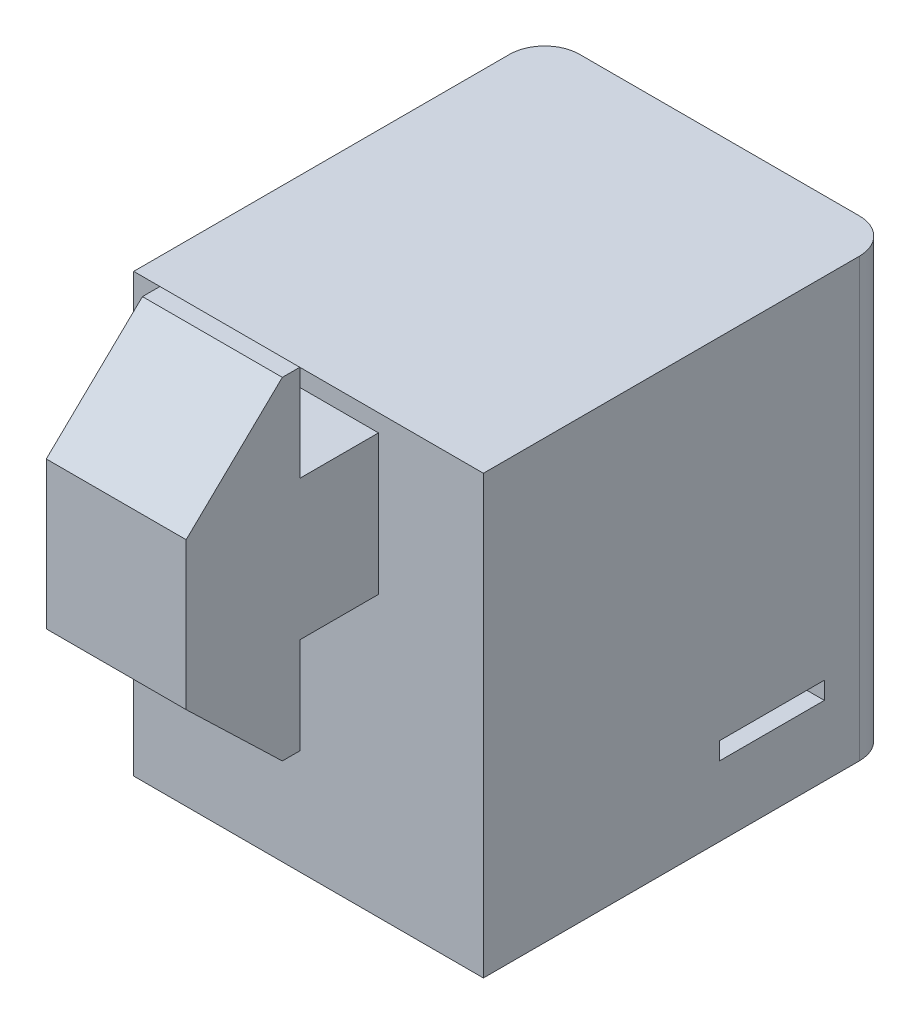
ISO-10303-21;
HEADER;
FILE_DESCRIPTION(('STEP AP214'),'2;1');
FILE_NAME('part.step','',(''),(''),'','','');
FILE_SCHEMA(('AUTOMOTIVE_DESIGN { 1 0 10303 214 1 1 1 1 }'));
ENDSEC;
DATA;
#1=APPLICATION_CONTEXT('core data for automotive mechanical design processes');
#2=APPLICATION_PROTOCOL_DEFINITION('international standard','automotive_design',2000,#1);
#3=PRODUCT_CONTEXT('',#1,'mechanical');
#4=PRODUCT('Part','Part','',(#3));
#5=PRODUCT_RELATED_PRODUCT_CATEGORY('part','',(#4));
#6=PRODUCT_DEFINITION_FORMATION('','',#4);
#7=PRODUCT_DEFINITION_CONTEXT('part definition',#1,'design');
#8=PRODUCT_DEFINITION('design','',#6,#7);
#9=PRODUCT_DEFINITION_SHAPE('','',#8);
#10=(LENGTH_UNIT() NAMED_UNIT(*) SI_UNIT(.MILLI.,.METRE.));
#11=(NAMED_UNIT(*) PLANE_ANGLE_UNIT() SI_UNIT($,.RADIAN.));
#12=(NAMED_UNIT(*) SI_UNIT($,.STERADIAN.) SOLID_ANGLE_UNIT());
#13=UNCERTAINTY_MEASURE_WITH_UNIT(LENGTH_MEASURE(1.E-05),#10,'distance_accuracy_value','');
#14=(GEOMETRIC_REPRESENTATION_CONTEXT(3) GLOBAL_UNCERTAINTY_ASSIGNED_CONTEXT((#13)) GLOBAL_UNIT_ASSIGNED_CONTEXT((#10,
#11,#12)) REPRESENTATION_CONTEXT('',''));
#15=CARTESIAN_POINT('',(0.,0.,0.));
#16=DIRECTION('',(0.,0.,1.));
#17=DIRECTION('',(1.,0.,0.));
#18=AXIS2_PLACEMENT_3D('',#15,#16,#17);
#19=CARTESIAN_POINT('',(4.,0.,0.));
#20=DIRECTION('',(1.,0.,0.));
#21=DIRECTION('',(0.,0.,-1.));
#22=AXIS2_PLACEMENT_3D('',#19,#20,#21);
#23=PLANE('',#22);
#24=DIRECTION('',(0.,-1.,0.));
#25=VECTOR('',#24,1.);
#26=CARTESIAN_POINT('',(4.,-20.,0.));
#27=LINE('',#26,#25);
#28=CARTESIAN_POINT('',(4.,3.99999999999983,0.));
#29=VERTEX_POINT('',#28);
#30=CARTESIAN_POINT('',(4.00000000000005,-3.99999999999983,0.));
#31=VERTEX_POINT('',#30);
#32=EDGE_CURVE('E420',#29,#31,#27,.T.);
#33=ORIENTED_EDGE('',*,*,#32,.F.);
#34=DIRECTION('',(0.,0.,1.));
#35=VECTOR('',#34,1.);
#36=CARTESIAN_POINT('',(4.00000000000005,3.99999999999983,0.));
#37=LINE('',#36,#35);
#38=CARTESIAN_POINT('',(4.00000000000005,3.99999999999983,4.5));
#39=VERTEX_POINT('',#38);
#40=EDGE_CURVE('E347',#29,#39,#37,.T.);
#41=ORIENTED_EDGE('',*,*,#40,.T.);
#42=DIRECTION('',(0.,1.,0.));
#43=VECTOR('',#42,1.);
#44=CARTESIAN_POINT('',(4.,5.,4.50000000000008));
#45=LINE('',#44,#43);
#46=CARTESIAN_POINT('',(4.,9.5,4.50000000000008));
#47=VERTEX_POINT('',#46);
#48=EDGE_CURVE('E381',#39,#47,#45,.T.);
#49=ORIENTED_EDGE('',*,*,#48,.T.);
#50=DIRECTION('',(0.,0.,-1.));
#51=VECTOR('',#50,1.);
#52=CARTESIAN_POINT('',(4.,9.5,4.50000000000008));
#53=LINE('',#52,#51);
#54=CARTESIAN_POINT('',(4.,9.5,5.50000000000008));
#55=VERTEX_POINT('',#54);
#56=EDGE_CURVE('E402',#55,#47,#53,.T.);
#57=ORIENTED_EDGE('',*,*,#56,.F.);
#58=DIRECTION('',(0.,0.693321869216339,-0.720628049458499));
#59=VECTOR('',#58,1.);
#60=CARTESIAN_POINT('',(4.,4.20840708524292,11.));
#61=LINE('',#60,#59);
#62=CARTESIAN_POINT('',(4.,4.20840708524292,11.));
#63=VERTEX_POINT('',#62);
#64=EDGE_CURVE('E393',#63,#55,#61,.T.);
#65=ORIENTED_EDGE('',*,*,#64,.F.);
#66=DIRECTION('',(0.,-1.,0.));
#67=VECTOR('',#66,1.);
#68=CARTESIAN_POINT('',(4.,5.,11.));
#69=LINE('',#68,#67);
#70=CARTESIAN_POINT('',(4.,-4.20840708524293,11.));
#71=VERTEX_POINT('',#70);
#72=EDGE_CURVE('E406',#63,#71,#69,.T.);
#73=ORIENTED_EDGE('',*,*,#72,.T.);
#74=DIRECTION('',(0.,-0.693321869216334,-0.720628049458505));
#75=VECTOR('',#74,1.);
#76=CARTESIAN_POINT('',(4.,-4.20840708524293,11.));
#77=LINE('',#76,#75);
#78=CARTESIAN_POINT('',(3.99999999999993,-9.5,5.5));
#79=VERTEX_POINT('',#78);
#80=EDGE_CURVE('E408',#71,#79,#77,.T.);
#81=ORIENTED_EDGE('',*,*,#80,.T.);
#82=DIRECTION('',(0.,0.,1.));
#83=VECTOR('',#82,1.);
#84=CARTESIAN_POINT('',(3.99999999999993,-9.5,4.5));
#85=LINE('',#84,#83);
#86=CARTESIAN_POINT('',(4.00000000000005,-9.5,4.5));
#87=VERTEX_POINT('',#86);
#88=EDGE_CURVE('E368',#87,#79,#85,.T.);
#89=ORIENTED_EDGE('',*,*,#88,.F.);
#90=DIRECTION('',(0.,1.,0.));
#91=VECTOR('',#90,1.);
#92=CARTESIAN_POINT('',(4.00000000000005,-20.,4.5));
#93=LINE('',#92,#91);
#94=CARTESIAN_POINT('',(4.00000000000005,-3.99999999999983,4.5));
#95=VERTEX_POINT('',#94);
#96=EDGE_CURVE('E350',#87,#95,#93,.T.);
#97=ORIENTED_EDGE('',*,*,#96,.T.);
#98=DIRECTION('',(0.,0.,1.));
#99=VECTOR('',#98,1.);
#100=CARTESIAN_POINT('',(4.00000000000005,-3.99999999999983,0.));
#101=LINE('',#100,#99);
#102=EDGE_CURVE('E362',#31,#95,#101,.T.);
#103=ORIENTED_EDGE('',*,*,#102,.F.);
#104=EDGE_LOOP('',(#33,#41,#49,#57,#65,#73,#81,#89,#97,#103));
#105=FACE_BOUND('',#104,.T.);
#106=ADVANCED_FACE('F33',(#105),#23,.T.);
#107=CARTESIAN_POINT('',(-10.,5.,11.));
#108=DIRECTION('',(1.,0.,0.));
#109=DIRECTION('',(0.,0.,-1.));
#110=AXIS2_PLACEMENT_3D('',#107,#108,#109);
#111=PLANE('',#110);
#112=DIRECTION('',(0.,1.,0.));
#113=VECTOR('',#112,1.);
#114=CARTESIAN_POINT('',(-10.,-16.,-13.5));
#115=LINE('',#114,#113);
#116=CARTESIAN_POINT('',(-10.,-16.,-13.5));
#117=VERTEX_POINT('',#116);
#118=CARTESIAN_POINT('',(-10.,-15.,-13.5));
#119=VERTEX_POINT('',#118);
#120=EDGE_CURVE('E310',#117,#119,#115,.T.);
#121=ORIENTED_EDGE('',*,*,#120,.F.);
#122=DIRECTION('',(0.,0.,1.));
#123=VECTOR('',#122,1.);
#124=CARTESIAN_POINT('',(-10.,-16.,-19.5));
#125=LINE('',#124,#123);
#126=CARTESIAN_POINT('',(-10.,-16.,-19.5));
#127=VERTEX_POINT('',#126);
#128=EDGE_CURVE('E288',#127,#117,#125,.T.);
#129=ORIENTED_EDGE('',*,*,#128,.F.);
#130=DIRECTION('',(0.,-1.,0.));
#131=VECTOR('',#130,1.);
#132=CARTESIAN_POINT('',(-10.,-15.,-19.5));
#133=LINE('',#132,#131);
#134=CARTESIAN_POINT('',(-10.,-15.,-19.5));
#135=VERTEX_POINT('',#134);
#136=EDGE_CURVE('E299',#135,#127,#133,.T.);
#137=ORIENTED_EDGE('',*,*,#136,.F.);
#138=DIRECTION('',(0.,0.,-1.));
#139=VECTOR('',#138,1.);
#140=CARTESIAN_POINT('',(-10.,-15.,-13.5));
#141=LINE('',#140,#139);
#142=EDGE_CURVE('E313',#119,#135,#141,.T.);
#143=ORIENTED_EDGE('',*,*,#142,.F.);
#144=EDGE_LOOP('',(#121,#129,#137,#143));
#145=FACE_BOUND('',#144,.T.);
#146=DIRECTION('',(0.,0.,1.));
#147=VECTOR('',#146,1.);
#148=CARTESIAN_POINT('',(-10.,5.,-23.5));
#149=LINE('',#148,#147);
#150=CARTESIAN_POINT('',(-10.,5.,-21.4999999999828));
#151=VERTEX_POINT('',#150);
#152=CARTESIAN_POINT('',(-9.99999999999996,5.,0.));
#153=VERTEX_POINT('',#152);
#154=EDGE_CURVE('E374',#151,#153,#149,.T.);
#155=ORIENTED_EDGE('',*,*,#154,.F.);
#156=DIRECTION('',(0.,1.,3.44815172583473E-12));
#157=VECTOR('',#156,1.);
#158=CARTESIAN_POINT('',(-10.,5.00000000011206,-21.4999999999828));
#159=LINE('',#158,#157);
#160=CARTESIAN_POINT('',(-10.,-20.,-21.500000000069));
#161=VERTEX_POINT('',#160);
#162=EDGE_CURVE('E11',#151,#161,#159,.F.);
#163=ORIENTED_EDGE('',*,*,#162,.T.);
#164=DIRECTION('',(0.,0.,-1.));
#165=VECTOR('',#164,1.);
#166=CARTESIAN_POINT('',(-10.,-20.,-23.5));
#167=LINE('',#166,#165);
#168=CARTESIAN_POINT('',(-9.99999999999996,-20.,0.));
#169=VERTEX_POINT('',#168);
#170=EDGE_CURVE('E384',#169,#161,#167,.T.);
#171=ORIENTED_EDGE('',*,*,#170,.F.);
#172=DIRECTION('',(0.,-1.,0.));
#173=VECTOR('',#172,1.);
#174=CARTESIAN_POINT('',(-9.99999999999996,5.,0.));
#175=LINE('',#174,#173);
#176=EDGE_CURVE('E338',#153,#169,#175,.T.);
#177=ORIENTED_EDGE('',*,*,#176,.F.);
#178=EDGE_LOOP('',(#155,#163,#171,#177));
#179=FACE_BOUND('',#178,.T.);
#180=ADVANCED_FACE('F480',(#145,#179),#111,.F.);
#181=CARTESIAN_POINT('',(4.,-20.,0.));
#182=DIRECTION('',(0.,-1.,0.));
#183=DIRECTION('',(0.,0.,-1.));
#184=AXIS2_PLACEMENT_3D('',#181,#182,#183);
#185=PLANE('',#184);
#186=CARTESIAN_POINT('',(7.49934200687802E-11,-20.,-11.9000248998002));
#187=DIRECTION('',(0.,-1.,0.));
#188=DIRECTION('',(0.,0.,-1.));
#189=AXIS2_PLACEMENT_3D('',#186,#187,#188);
#190=CIRCLE('',#189,3.100000000075);
#191=CARTESIAN_POINT('',(-3.10000000000001,-20.,-11.9000248998002));
#192=VERTEX_POINT('',#191);
#193=CARTESIAN_POINT('',(3.10000000014999,-20.,-11.9000248998002));
#194=VERTEX_POINT('',#193);
#195=EDGE_CURVE('E259',#192,#194,#190,.T.);
#196=ORIENTED_EDGE('',*,*,#195,.F.);
#197=DIRECTION('',(0.,0.,-1.));
#198=VECTOR('',#197,1.);
#199=CARTESIAN_POINT('',(-3.10000000000001,-20.,-8.09997510019977));
#200=LINE('',#199,#198);
#201=CARTESIAN_POINT('',(-3.10000000000001,-20.,-8.09997510019977));
#202=VERTEX_POINT('',#201);
#203=EDGE_CURVE('E267',#202,#192,#200,.T.);
#204=ORIENTED_EDGE('',*,*,#203,.F.);
#205=CARTESIAN_POINT('',(7.49929942054203E-11,-20.,-8.09997510019977));
#206=DIRECTION('',(0.,-1.,0.));
#207=DIRECTION('',(0.,0.,-1.));
#208=AXIS2_PLACEMENT_3D('',#205,#206,#207);
#209=CIRCLE('',#208,3.100000000075);
#210=CARTESIAN_POINT('',(3.10000000014999,-20.,-8.09997510019977));
#211=VERTEX_POINT('',#210);
#212=EDGE_CURVE('E281',#211,#202,#209,.T.);
#213=ORIENTED_EDGE('',*,*,#212,.F.);
#214=DIRECTION('',(0.,0.,1.));
#215=VECTOR('',#214,1.);
#216=CARTESIAN_POINT('',(3.10000000014999,-20.,-11.9000248998002));
#217=LINE('',#216,#215);
#218=EDGE_CURVE('E278',#194,#211,#217,.T.);
#219=ORIENTED_EDGE('',*,*,#218,.F.);
#220=EDGE_LOOP('',(#196,#204,#213,#219));
#221=FACE_BOUND('',#220,.T.);
#222=DIRECTION('',(1.,0.,0.));
#223=VECTOR('',#222,1.);
#224=CARTESIAN_POINT('',(4.,-20.,-23.5));
#225=LINE('',#224,#223);
#226=CARTESIAN_POINT('',(-8.,-20.,-23.5));
#227=VERTEX_POINT('',#226);
#228=CARTESIAN_POINT('',(8.,-20.,-23.5));
#229=VERTEX_POINT('',#228);
#230=EDGE_CURVE('E387',#227,#229,#225,.T.);
#231=ORIENTED_EDGE('',*,*,#230,.T.);
#232=CARTESIAN_POINT('',(8.,-20.,-21.500000000069));
#233=DIRECTION('',(0.,-1.,0.));
#234=DIRECTION('',(0.,0.,-1.));
#235=AXIS2_PLACEMENT_3D('',#232,#233,#234);
#236=CIRCLE('',#235,2.);
#237=CARTESIAN_POINT('',(10.,-20.,-21.500000000069));
#238=VERTEX_POINT('',#237);
#239=EDGE_CURVE('E41',#229,#238,#236,.T.);
#240=ORIENTED_EDGE('',*,*,#239,.T.);
#241=DIRECTION('',(0.,0.,-1.));
#242=VECTOR('',#241,1.);
#243=CARTESIAN_POINT('',(10.,-20.,-23.5));
#244=LINE('',#243,#242);
#245=CARTESIAN_POINT('',(10.,-20.,0.));
#246=VERTEX_POINT('',#245);
#247=EDGE_CURVE('E331',#246,#238,#244,.T.);
#248=ORIENTED_EDGE('',*,*,#247,.F.);
#249=DIRECTION('',(1.,0.,0.));
#250=VECTOR('',#249,1.);
#251=CARTESIAN_POINT('',(-9.99999999999996,-20.,0.));
#252=LINE('',#251,#250);
#253=EDGE_CURVE('E341',#169,#246,#252,.T.);
#254=ORIENTED_EDGE('',*,*,#253,.F.);
#255=ORIENTED_EDGE('',*,*,#170,.T.);
#256=CARTESIAN_POINT('',(-8.,-20.,-21.500000000069));
#257=DIRECTION('',(0.,-1.,0.));
#258=DIRECTION('',(0.,0.,-1.));
#259=AXIS2_PLACEMENT_3D('',#256,#257,#258);
#260=CIRCLE('',#259,2.);
#261=EDGE_CURVE('E459',#161,#227,#260,.T.);
#262=ORIENTED_EDGE('',*,*,#261,.T.);
#263=EDGE_LOOP('',(#231,#240,#248,#254,#255,#262));
#264=FACE_BOUND('',#263,.T.);
#265=ADVANCED_FACE('F463',(#221,#264),#185,.T.);
#266=CARTESIAN_POINT('',(4.,5.,-23.5));
#267=DIRECTION('',(0.,-1.,0.));
#268=DIRECTION('',(0.,0.,-1.));
#269=AXIS2_PLACEMENT_3D('',#266,#267,#268);
#270=PLANE('',#269);
#271=DIRECTION('',(0.,0.,1.));
#272=VECTOR('',#271,1.);
#273=CARTESIAN_POINT('',(10.,5.,0.));
#274=LINE('',#273,#272);
#275=CARTESIAN_POINT('',(10.,5.,-21.4999999999828));
#276=VERTEX_POINT('',#275);
#277=CARTESIAN_POINT('',(10.,5.,0.));
#278=VERTEX_POINT('',#277);
#279=EDGE_CURVE('E320',#276,#278,#274,.T.);
#280=ORIENTED_EDGE('',*,*,#279,.F.);
#281=CARTESIAN_POINT('',(8.,5.,-21.4999999999828));
#282=DIRECTION('',(0.,-1.,0.));
#283=DIRECTION('',(0.,0.,-1.));
#284=AXIS2_PLACEMENT_3D('',#281,#282,#283);
#285=CIRCLE('',#284,2.);
#286=CARTESIAN_POINT('',(8.,5.,-23.5));
#287=VERTEX_POINT('',#286);
#288=EDGE_CURVE('E453',#276,#287,#285,.F.);
#289=ORIENTED_EDGE('',*,*,#288,.T.);
#290=DIRECTION('',(-1.,0.,0.));
#291=VECTOR('',#290,1.);
#292=CARTESIAN_POINT('',(4.,5.,-23.5));
#293=LINE('',#292,#291);
#294=CARTESIAN_POINT('',(-8.,5.,-23.5));
#295=VERTEX_POINT('',#294);
#296=EDGE_CURVE('E371',#287,#295,#293,.T.);
#297=ORIENTED_EDGE('',*,*,#296,.T.);
#298=CARTESIAN_POINT('',(-8.,5.,-21.4999999999828));
#299=DIRECTION('',(0.,-1.,0.));
#300=DIRECTION('',(0.,0.,-1.));
#301=AXIS2_PLACEMENT_3D('',#298,#299,#300);
#302=CIRCLE('',#301,2.);
#303=EDGE_CURVE('E451',#295,#151,#302,.F.);
#304=ORIENTED_EDGE('',*,*,#303,.T.);
#305=ORIENTED_EDGE('',*,*,#154,.T.);
#306=DIRECTION('',(-1.,0.,0.));
#307=VECTOR('',#306,1.);
#308=CARTESIAN_POINT('',(4.00000000000005,5.,0.));
#309=LINE('',#308,#307);
#310=EDGE_CURVE('E335',#278,#153,#309,.T.);
#311=ORIENTED_EDGE('',*,*,#310,.F.);
#312=EDGE_LOOP('',(#280,#289,#297,#304,#305,#311));
#313=FACE_BOUND('',#312,.T.);
#314=ADVANCED_FACE('F473',(#313),#270,.F.);
#315=CARTESIAN_POINT('',(-4.,-4.20840708524293,11.));
#316=DIRECTION('',(0.,-0.720628049458505,0.693321869216334));
#317=DIRECTION('',(0.,-0.693321869216334,-0.720628049458505));
#318=AXIS2_PLACEMENT_3D('',#315,#316,#317);
#319=PLANE('',#318);
#320=ORIENTED_EDGE('',*,*,#80,.F.);
#321=DIRECTION('',(1.,0.,0.));
#322=VECTOR('',#321,1.);
#323=CARTESIAN_POINT('',(-4.,-4.20840708524293,11.));
#324=LINE('',#323,#322);
#325=CARTESIAN_POINT('',(-4.,-4.20840708524292,11.));
#326=VERTEX_POINT('',#325);
#327=EDGE_CURVE('E417',#326,#71,#324,.T.);
#328=ORIENTED_EDGE('',*,*,#327,.F.);
#329=DIRECTION('',(0.,-0.693321869216334,-0.720628049458505));
#330=VECTOR('',#329,1.);
#331=CARTESIAN_POINT('',(-4.,-4.20840708524293,11.));
#332=LINE('',#331,#330);
#333=CARTESIAN_POINT('',(-4.00000000000007,-9.5,5.5));
#334=VERTEX_POINT('',#333);
#335=EDGE_CURVE('E411',#326,#334,#332,.T.);
#336=ORIENTED_EDGE('',*,*,#335,.T.);
#337=DIRECTION('',(1.,0.,0.));
#338=VECTOR('',#337,1.);
#339=CARTESIAN_POINT('',(-4.,-9.5,5.5));
#340=LINE('',#339,#338);
#341=EDGE_CURVE('E414',#334,#79,#340,.T.);
#342=ORIENTED_EDGE('',*,*,#341,.T.);
#343=EDGE_LOOP('',(#320,#328,#336,#342));
#344=FACE_BOUND('',#343,.T.);
#345=ADVANCED_FACE('F524',(#344),#319,.T.);
#346=CARTESIAN_POINT('',(4.,5.,11.));
#347=DIRECTION('',(0.,0.,-1.));
#348=DIRECTION('',(0.,1.,0.));
#349=AXIS2_PLACEMENT_3D('',#346,#347,#348);
#350=PLANE('',#349);
#351=DIRECTION('',(1.,0.,0.));
#352=VECTOR('',#351,1.);
#353=CARTESIAN_POINT('',(-4.,4.20840708524292,11.));
#354=LINE('',#353,#352);
#355=CARTESIAN_POINT('',(-4.,4.20840708524292,11.));
#356=VERTEX_POINT('',#355);
#357=EDGE_CURVE('E397',#356,#63,#354,.T.);
#358=ORIENTED_EDGE('',*,*,#357,.F.);
#359=DIRECTION('',(0.,1.,0.));
#360=VECTOR('',#359,1.);
#361=CARTESIAN_POINT('',(-4.,-9.5,11.));
#362=LINE('',#361,#360);
#363=EDGE_CURVE('E389',#326,#356,#362,.T.);
#364=ORIENTED_EDGE('',*,*,#363,.F.);
#365=ORIENTED_EDGE('',*,*,#327,.T.);
#366=ORIENTED_EDGE('',*,*,#72,.F.);
#367=EDGE_LOOP('',(#358,#364,#365,#366));
#368=FACE_BOUND('',#367,.T.);
#369=ADVANCED_FACE('F520',(#368),#350,.F.);
#370=CARTESIAN_POINT('',(-10.,9.5,2.25000000000004));
#371=DIRECTION('',(0.,1.,0.));
#372=DIRECTION('',(0.,0.,1.));
#373=AXIS2_PLACEMENT_3D('',#370,#371,#372);
#374=PLANE('',#373);
#375=DIRECTION('',(1.,0.,0.));
#376=VECTOR('',#375,1.);
#377=CARTESIAN_POINT('',(-4.,9.5,4.5));
#378=LINE('',#377,#376);
#379=CARTESIAN_POINT('',(-4.,9.5,4.5));
#380=VERTEX_POINT('',#379);
#381=EDGE_CURVE('E375',#380,#47,#378,.T.);
#382=ORIENTED_EDGE('',*,*,#381,.F.);
#383=DIRECTION('',(0.,0.,-1.));
#384=VECTOR('',#383,1.);
#385=CARTESIAN_POINT('',(-4.,9.5,5.50000000000008));
#386=LINE('',#385,#384);
#387=CARTESIAN_POINT('',(-4.,9.5,5.50000000000008));
#388=VERTEX_POINT('',#387);
#389=EDGE_CURVE('E370',#388,#380,#386,.T.);
#390=ORIENTED_EDGE('',*,*,#389,.F.);
#391=DIRECTION('',(1.,0.,0.));
#392=VECTOR('',#391,1.);
#393=CARTESIAN_POINT('',(-4.,9.5,5.50000000000008));
#394=LINE('',#393,#392);
#395=EDGE_CURVE('E399',#388,#55,#394,.T.);
#396=ORIENTED_EDGE('',*,*,#395,.T.);
#397=ORIENTED_EDGE('',*,*,#56,.T.);
#398=EDGE_LOOP('',(#382,#390,#396,#397));
#399=FACE_BOUND('',#398,.T.);
#400=ADVANCED_FACE('F512',(#399),#374,.T.);
#401=CARTESIAN_POINT('',(-4.,4.20840708524292,11.));
#402=DIRECTION('',(0.,-0.720628049458499,-0.693321869216339));
#403=DIRECTION('',(0.,0.693321869216339,-0.720628049458499));
#404=AXIS2_PLACEMENT_3D('',#401,#402,#403);
#405=PLANE('',#404);
#406=ORIENTED_EDGE('',*,*,#64,.T.);
#407=ORIENTED_EDGE('',*,*,#395,.F.);
#408=DIRECTION('',(0.,0.693321869216339,-0.720628049458499));
#409=VECTOR('',#408,1.);
#410=CARTESIAN_POINT('',(-4.,4.20840708524292,11.));
#411=LINE('',#410,#409);
#412=EDGE_CURVE('E394',#356,#388,#411,.T.);
#413=ORIENTED_EDGE('',*,*,#412,.F.);
#414=ORIENTED_EDGE('',*,*,#357,.T.);
#415=EDGE_LOOP('',(#406,#407,#413,#414));
#416=FACE_BOUND('',#415,.T.);
#417=ADVANCED_FACE('F763',(#416),#405,.F.);
#418=CARTESIAN_POINT('',(-4.,-9.5,5.5));
#419=DIRECTION('',(1.,0.,0.));
#420=DIRECTION('',(0.,0.,-1.));
#421=AXIS2_PLACEMENT_3D('',#418,#419,#420);
#422=PLANE('',#421);
#423=ORIENTED_EDGE('',*,*,#335,.F.);
#424=ORIENTED_EDGE('',*,*,#363,.T.);
#425=ORIENTED_EDGE('',*,*,#412,.T.);
#426=ORIENTED_EDGE('',*,*,#389,.T.);
#427=DIRECTION('',(0.,1.,0.));
#428=VECTOR('',#427,1.);
#429=CARTESIAN_POINT('',(-4.,5.,4.5));
#430=LINE('',#429,#428);
#431=CARTESIAN_POINT('',(-3.99999999999996,3.99999999999983,4.5));
#432=VERTEX_POINT('',#431);
#433=EDGE_CURVE('E377',#432,#380,#430,.T.);
#434=ORIENTED_EDGE('',*,*,#433,.F.);
#435=DIRECTION('',(0.,0.,1.));
#436=VECTOR('',#435,1.);
#437=CARTESIAN_POINT('',(-3.99999999999996,3.99999999999983,0.));
#438=LINE('',#437,#436);
#439=CARTESIAN_POINT('',(-3.99999999999996,3.99999999999983,0.));
#440=VERTEX_POINT('',#439);
#441=EDGE_CURVE('E355',#440,#432,#438,.T.);
#442=ORIENTED_EDGE('',*,*,#441,.F.);
#443=DIRECTION('',(0.,1.,0.));
#444=VECTOR('',#443,1.);
#445=CARTESIAN_POINT('',(-3.99999999999996,-3.99999999999983,0.));
#446=LINE('',#445,#444);
#447=CARTESIAN_POINT('',(-3.99999999999996,-3.99999999999983,0.));
#448=VERTEX_POINT('',#447);
#449=EDGE_CURVE('E344',#448,#440,#446,.T.);
#450=ORIENTED_EDGE('',*,*,#449,.F.);
#451=DIRECTION('',(0.,0.,1.));
#452=VECTOR('',#451,1.);
#453=CARTESIAN_POINT('',(-3.99999999999996,-3.99999999999983,0.));
#454=LINE('',#453,#452);
#455=CARTESIAN_POINT('',(-4.00000000000007,-3.99999999999983,4.5));
#456=VERTEX_POINT('',#455);
#457=EDGE_CURVE('E359',#448,#456,#454,.T.);
#458=ORIENTED_EDGE('',*,*,#457,.T.);
#459=DIRECTION('',(0.,1.,0.));
#460=VECTOR('',#459,1.);
#461=CARTESIAN_POINT('',(-4.00000000000007,-9.5,4.5));
#462=LINE('',#461,#460);
#463=CARTESIAN_POINT('',(-4.00000000000007,-9.5,4.5));
#464=VERTEX_POINT('',#463);
#465=EDGE_CURVE('E364',#464,#456,#462,.T.);
#466=ORIENTED_EDGE('',*,*,#465,.F.);
#467=DIRECTION('',(0.,0.,1.));
#468=VECTOR('',#467,1.);
#469=CARTESIAN_POINT('',(-4.00000000000007,-9.5,4.5));
#470=LINE('',#469,#468);
#471=EDGE_CURVE('E367',#464,#334,#470,.T.);
#472=ORIENTED_EDGE('',*,*,#471,.T.);
#473=EDGE_LOOP('',(#423,#424,#425,#426,#434,#442,#450,#458,#466,#472));
#474=FACE_BOUND('',#473,.T.);
#475=ADVANCED_FACE('F506',(#474),#422,.F.);
#476=CARTESIAN_POINT('',(0.,8.10315655571161E-11,-23.5));
#477=DIRECTION('',(0.,-3.44815172583473E-12,1.));
#478=DIRECTION('',(0.,-1.,-3.44815172583473E-12));
#479=AXIS2_PLACEMENT_3D('',#476,#477,#478);
#480=PLANE('',#479);
#481=ORIENTED_EDGE('',*,*,#296,.F.);
#482=DIRECTION('',(0.,1.,3.44815172583473E-12));
#483=VECTOR('',#482,1.);
#484=CARTESIAN_POINT('',(8.,8.10315655571161E-11,-23.5));
#485=LINE('',#484,#483);
#486=EDGE_CURVE('E54',#287,#229,#485,.F.);
#487=ORIENTED_EDGE('',*,*,#486,.T.);
#488=ORIENTED_EDGE('',*,*,#230,.F.);
#489=DIRECTION('',(0.,1.,3.44815172583473E-12));
#490=VECTOR('',#489,1.);
#491=CARTESIAN_POINT('',(-8.,8.10315655571161E-11,-23.5));
#492=LINE('',#491,#490);
#493=EDGE_CURVE('E455',#227,#295,#492,.T.);
#494=ORIENTED_EDGE('',*,*,#493,.T.);
#495=EDGE_LOOP('',(#481,#487,#488,#494));
#496=FACE_BOUND('',#495,.T.);
#497=ADVANCED_FACE('F475',(#496),#480,.F.);
#498=CARTESIAN_POINT('',(-4.,5.,4.5));
#499=DIRECTION('',(0.,0.,1.));
#500=DIRECTION('',(1.,0.,0.));
#501=AXIS2_PLACEMENT_3D('',#498,#499,#500);
#502=PLANE('',#501);
#503=ORIENTED_EDGE('',*,*,#381,.T.);
#504=ORIENTED_EDGE('',*,*,#48,.F.);
#505=DIRECTION('',(1.,0.,0.));
#506=VECTOR('',#505,1.);
#507=CARTESIAN_POINT('',(-3.99999999999996,3.99999999999983,4.5));
#508=LINE('',#507,#506);
#509=EDGE_CURVE('E334',#432,#39,#508,.T.);
#510=ORIENTED_EDGE('',*,*,#509,.F.);
#511=ORIENTED_EDGE('',*,*,#433,.T.);
#512=EDGE_LOOP('',(#503,#504,#510,#511));
#513=FACE_BOUND('',#512,.T.);
#514=ADVANCED_FACE('F510',(#513),#502,.F.);
#515=CARTESIAN_POINT('',(3.99999999999993,-9.5,4.5));
#516=DIRECTION('',(0.,1.,0.));
#517=DIRECTION('',(-1.,0.,0.));
#518=AXIS2_PLACEMENT_3D('',#515,#516,#517);
#519=PLANE('',#518);
#520=ORIENTED_EDGE('',*,*,#341,.F.);
#521=ORIENTED_EDGE('',*,*,#471,.F.);
#522=DIRECTION('',(-1.,0.,0.));
#523=VECTOR('',#522,1.);
#524=CARTESIAN_POINT('',(3.99999999999993,-9.5,4.5));
#525=LINE('',#524,#523);
#526=EDGE_CURVE('E358',#87,#464,#525,.T.);
#527=ORIENTED_EDGE('',*,*,#526,.F.);
#528=ORIENTED_EDGE('',*,*,#88,.T.);
#529=EDGE_LOOP('',(#520,#521,#527,#528));
#530=FACE_BOUND('',#529,.T.);
#531=ADVANCED_FACE('F526',(#530),#519,.F.);
#532=CARTESIAN_POINT('',(0.,0.,4.5));
#533=DIRECTION('',(0.,0.,1.));
#534=DIRECTION('',(1.,0.,0.));
#535=AXIS2_PLACEMENT_3D('',#532,#533,#534);
#536=PLANE('',#535);
#537=DIRECTION('',(-1.,0.,0.));
#538=VECTOR('',#537,1.);
#539=CARTESIAN_POINT('',(4.00000000000005,-3.99999999999983,4.5));
#540=LINE('',#539,#538);
#541=EDGE_CURVE('E353',#95,#456,#540,.T.);
#542=ORIENTED_EDGE('',*,*,#541,.F.);
#543=ORIENTED_EDGE('',*,*,#96,.F.);
#544=ORIENTED_EDGE('',*,*,#526,.T.);
#545=ORIENTED_EDGE('',*,*,#465,.T.);
#546=EDGE_LOOP('',(#542,#543,#544,#545));
#547=FACE_BOUND('',#546,.T.);
#548=ADVANCED_FACE('F501',(#547),#536,.F.);
#549=CARTESIAN_POINT('',(-3.99999999999996,3.99999999999983,0.));
#550=DIRECTION('',(0.,-1.,0.));
#551=DIRECTION('',(1.,0.,0.));
#552=AXIS2_PLACEMENT_3D('',#549,#550,#551);
#553=PLANE('',#552);
#554=ORIENTED_EDGE('',*,*,#509,.T.);
#555=ORIENTED_EDGE('',*,*,#40,.F.);
#556=DIRECTION('',(1.,0.,0.));
#557=VECTOR('',#556,1.);
#558=CARTESIAN_POINT('',(-3.99999999999996,3.99999999999983,0.));
#559=LINE('',#558,#557);
#560=EDGE_CURVE('E339',#440,#29,#559,.T.);
#561=ORIENTED_EDGE('',*,*,#560,.F.);
#562=ORIENTED_EDGE('',*,*,#441,.T.);
#563=EDGE_LOOP('',(#554,#555,#561,#562));
#564=FACE_BOUND('',#563,.T.);
#565=ADVANCED_FACE('F492',(#564),#553,.F.);
#566=CARTESIAN_POINT('',(4.00000000000005,-3.99999999999983,0.));
#567=DIRECTION('',(0.,1.,0.));
#568=DIRECTION('',(0.,0.,1.));
#569=AXIS2_PLACEMENT_3D('',#566,#567,#568);
#570=PLANE('',#569);
#571=ORIENTED_EDGE('',*,*,#541,.T.);
#572=ORIENTED_EDGE('',*,*,#457,.F.);
#573=DIRECTION('',(-1.,0.,0.));
#574=VECTOR('',#573,1.);
#575=CARTESIAN_POINT('',(4.00000000000005,-3.99999999999983,0.));
#576=LINE('',#575,#574);
#577=EDGE_CURVE('E343',#31,#448,#576,.T.);
#578=ORIENTED_EDGE('',*,*,#577,.F.);
#579=ORIENTED_EDGE('',*,*,#102,.T.);
#580=EDGE_LOOP('',(#571,#572,#578,#579));
#581=FACE_BOUND('',#580,.T.);
#582=ADVANCED_FACE('F485',(#581),#570,.F.);
#583=CARTESIAN_POINT('',(0.,0.,0.));
#584=DIRECTION('',(0.,0.,1.));
#585=DIRECTION('',(1.,0.,0.));
#586=AXIS2_PLACEMENT_3D('',#583,#584,#585);
#587=PLANE('',#586);
#588=DIRECTION('',(0.,-1.,0.));
#589=VECTOR('',#588,1.);
#590=CARTESIAN_POINT('',(10.,-20.,0.));
#591=LINE('',#590,#589);
#592=EDGE_CURVE('E328',#278,#246,#591,.T.);
#593=ORIENTED_EDGE('',*,*,#592,.F.);
#594=ORIENTED_EDGE('',*,*,#310,.T.);
#595=ORIENTED_EDGE('',*,*,#176,.T.);
#596=ORIENTED_EDGE('',*,*,#253,.T.);
#597=EDGE_LOOP('',(#593,#594,#595,#596));
#598=FACE_BOUND('',#597,.T.);
#599=ORIENTED_EDGE('',*,*,#560,.T.);
#600=ORIENTED_EDGE('',*,*,#32,.T.);
#601=ORIENTED_EDGE('',*,*,#577,.T.);
#602=ORIENTED_EDGE('',*,*,#449,.T.);
#603=EDGE_LOOP('',(#599,#600,#601,#602));
#604=FACE_BOUND('',#603,.T.);
#605=ADVANCED_FACE('F482',(#598,#604),#587,.T.);
#606=CARTESIAN_POINT('',(10.,0.,0.));
#607=DIRECTION('',(-1.,0.,0.));
#608=DIRECTION('',(0.,0.,1.));
#609=AXIS2_PLACEMENT_3D('',#606,#607,#608);
#610=PLANE('',#609);
#611=DIRECTION('',(0.,-1.,0.));
#612=VECTOR('',#611,1.);
#613=CARTESIAN_POINT('',(10.,-15.,-13.5));
#614=LINE('',#613,#612);
#615=CARTESIAN_POINT('',(10.,-15.,-13.5));
#616=VERTEX_POINT('',#615);
#617=CARTESIAN_POINT('',(10.,-16.,-13.5));
#618=VERTEX_POINT('',#617);
#619=EDGE_CURVE('E253',#616,#618,#614,.T.);
#620=ORIENTED_EDGE('',*,*,#619,.F.);
#621=DIRECTION('',(0.,0.,1.));
#622=VECTOR('',#621,1.);
#623=CARTESIAN_POINT('',(10.,-15.,-19.5));
#624=LINE('',#623,#622);
#625=CARTESIAN_POINT('',(10.,-15.,-19.5));
#626=VERTEX_POINT('',#625);
#627=EDGE_CURVE('E227',#626,#616,#624,.T.);
#628=ORIENTED_EDGE('',*,*,#627,.F.);
#629=DIRECTION('',(0.,1.,0.));
#630=VECTOR('',#629,1.);
#631=CARTESIAN_POINT('',(10.,-16.,-19.5));
#632=LINE('',#631,#630);
#633=CARTESIAN_POINT('',(10.,-16.,-19.5));
#634=VERTEX_POINT('',#633);
#635=EDGE_CURVE('E244',#634,#626,#632,.T.);
#636=ORIENTED_EDGE('',*,*,#635,.F.);
#637=DIRECTION('',(0.,0.,-1.));
#638=VECTOR('',#637,1.);
#639=CARTESIAN_POINT('',(10.,-16.,-13.5));
#640=LINE('',#639,#638);
#641=EDGE_CURVE('E247',#618,#634,#640,.T.);
#642=ORIENTED_EDGE('',*,*,#641,.F.);
#643=EDGE_LOOP('',(#620,#628,#636,#642));
#644=FACE_BOUND('',#643,.T.);
#645=ORIENTED_EDGE('',*,*,#247,.T.);
#646=DIRECTION('',(0.,1.,3.44815172583473E-12));
#647=VECTOR('',#646,1.);
#648=CARTESIAN_POINT('',(10.,7.41352621054466E-11,-21.5));
#649=LINE('',#648,#647);
#650=EDGE_CURVE('E433',#238,#276,#649,.T.);
#651=ORIENTED_EDGE('',*,*,#650,.T.);
#652=ORIENTED_EDGE('',*,*,#279,.T.);
#653=ORIENTED_EDGE('',*,*,#592,.T.);
#654=EDGE_LOOP('',(#645,#651,#652,#653));
#655=FACE_BOUND('',#654,.T.);
#656=ADVANCED_FACE('F468',(#644,#655),#610,.F.);
#657=CARTESIAN_POINT('',(-5.,-16.,-19.5));
#658=DIRECTION('',(0.,-1.,0.));
#659=DIRECTION('',(0.,0.,-1.));
#660=AXIS2_PLACEMENT_3D('',#657,#658,#659);
#661=PLANE('',#660);
#662=ORIENTED_EDGE('',*,*,#128,.T.);
#663=DIRECTION('',(-1.,0.,0.));
#664=VECTOR('',#663,1.);
#665=CARTESIAN_POINT('',(-5.,-16.,-13.5));
#666=LINE('',#665,#664);
#667=CARTESIAN_POINT('',(-5.,-16.,-13.5));
#668=VERTEX_POINT('',#667);
#669=EDGE_CURVE('E308',#668,#117,#666,.T.);
#670=ORIENTED_EDGE('',*,*,#669,.F.);
#671=DIRECTION('',(0.,0.,1.));
#672=VECTOR('',#671,1.);
#673=CARTESIAN_POINT('',(-5.,-16.,-19.5));
#674=LINE('',#673,#672);
#675=CARTESIAN_POINT('',(-5.,-16.,-19.5));
#676=VERTEX_POINT('',#675);
#677=EDGE_CURVE('E295',#676,#668,#674,.T.);
#678=ORIENTED_EDGE('',*,*,#677,.F.);
#679=DIRECTION('',(-1.,0.,0.));
#680=VECTOR('',#679,1.);
#681=CARTESIAN_POINT('',(-5.,-16.,-19.5));
#682=LINE('',#681,#680);
#683=EDGE_CURVE('E318',#676,#127,#682,.T.);
#684=ORIENTED_EDGE('',*,*,#683,.T.);
#685=EDGE_LOOP('',(#662,#670,#678,#684));
#686=FACE_BOUND('',#685,.T.);
#687=ADVANCED_FACE('F597',(#686),#661,.F.);
#688=CARTESIAN_POINT('',(-5.,-15.,-19.5));
#689=DIRECTION('',(0.,0.,-1.));
#690=DIRECTION('',(-1.,0.,0.));
#691=AXIS2_PLACEMENT_3D('',#688,#689,#690);
#692=PLANE('',#691);
#693=ORIENTED_EDGE('',*,*,#136,.T.);
#694=ORIENTED_EDGE('',*,*,#683,.F.);
#695=DIRECTION('',(0.,-1.,0.));
#696=VECTOR('',#695,1.);
#697=CARTESIAN_POINT('',(-5.,-15.,-19.5));
#698=LINE('',#697,#696);
#699=CARTESIAN_POINT('',(-5.,-15.,-19.5));
#700=VERTEX_POINT('',#699);
#701=EDGE_CURVE('E305',#700,#676,#698,.T.);
#702=ORIENTED_EDGE('',*,*,#701,.F.);
#703=DIRECTION('',(-1.,0.,0.));
#704=VECTOR('',#703,1.);
#705=CARTESIAN_POINT('',(-5.,-15.,-19.5));
#706=LINE('',#705,#704);
#707=EDGE_CURVE('E321',#700,#135,#706,.T.);
#708=ORIENTED_EDGE('',*,*,#707,.T.);
#709=EDGE_LOOP('',(#693,#694,#702,#708));
#710=FACE_BOUND('',#709,.T.);
#711=ADVANCED_FACE('F593',(#710),#692,.F.);
#712=CARTESIAN_POINT('',(-5.,-15.,-13.5));
#713=DIRECTION('',(0.,1.,0.));
#714=DIRECTION('',(0.,0.,1.));
#715=AXIS2_PLACEMENT_3D('',#712,#713,#714);
#716=PLANE('',#715);
#717=ORIENTED_EDGE('',*,*,#142,.T.);
#718=ORIENTED_EDGE('',*,*,#707,.F.);
#719=DIRECTION('',(0.,0.,-1.));
#720=VECTOR('',#719,1.);
#721=CARTESIAN_POINT('',(-5.,-15.,-13.5));
#722=LINE('',#721,#720);
#723=CARTESIAN_POINT('',(-5.,-15.,-13.5));
#724=VERTEX_POINT('',#723);
#725=EDGE_CURVE('E302',#724,#700,#722,.T.);
#726=ORIENTED_EDGE('',*,*,#725,.F.);
#727=DIRECTION('',(-1.,0.,0.));
#728=VECTOR('',#727,1.);
#729=CARTESIAN_POINT('',(-5.,-15.,-13.5));
#730=LINE('',#729,#728);
#731=EDGE_CURVE('E323',#724,#119,#730,.T.);
#732=ORIENTED_EDGE('',*,*,#731,.T.);
#733=EDGE_LOOP('',(#717,#718,#726,#732));
#734=FACE_BOUND('',#733,.T.);
#735=ADVANCED_FACE('F596',(#734),#716,.F.);
#736=CARTESIAN_POINT('',(-5.,-16.,-13.5));
#737=DIRECTION('',(0.,0.,1.));
#738=DIRECTION('',(1.,0.,0.));
#739=AXIS2_PLACEMENT_3D('',#736,#737,#738);
#740=PLANE('',#739);
#741=ORIENTED_EDGE('',*,*,#120,.T.);
#742=ORIENTED_EDGE('',*,*,#731,.F.);
#743=DIRECTION('',(0.,1.,0.));
#744=VECTOR('',#743,1.);
#745=CARTESIAN_POINT('',(-5.,-16.,-13.5));
#746=LINE('',#745,#744);
#747=EDGE_CURVE('E298',#668,#724,#746,.T.);
#748=ORIENTED_EDGE('',*,*,#747,.F.);
#749=ORIENTED_EDGE('',*,*,#669,.T.);
#750=EDGE_LOOP('',(#741,#742,#748,#749));
#751=FACE_BOUND('',#750,.T.);
#752=ADVANCED_FACE('F591',(#751),#740,.F.);
#753=CARTESIAN_POINT('',(-5.,0.,0.));
#754=DIRECTION('',(-1.,0.,0.));
#755=DIRECTION('',(0.,0.,1.));
#756=AXIS2_PLACEMENT_3D('',#753,#754,#755);
#757=PLANE('',#756);
#758=ORIENTED_EDGE('',*,*,#677,.T.);
#759=ORIENTED_EDGE('',*,*,#747,.T.);
#760=ORIENTED_EDGE('',*,*,#725,.T.);
#761=ORIENTED_EDGE('',*,*,#701,.T.);
#762=EDGE_LOOP('',(#758,#759,#760,#761));
#763=FACE_BOUND('',#762,.T.);
#764=ADVANCED_FACE('F587',(#763),#757,.T.);
#765=CARTESIAN_POINT('',(7.49916853453042E-11,-6.,-11.9000248998002));
#766=DIRECTION('',(0.,-1.,0.));
#767=DIRECTION('',(0.,0.,-1.));
#768=AXIS2_PLACEMENT_3D('',#765,#766,#767);
#769=CYLINDRICAL_SURFACE('',#768,3.100000000075);
#770=ORIENTED_EDGE('',*,*,#195,.T.);
#771=DIRECTION('',(0.,-1.,0.));
#772=VECTOR('',#771,1.);
#773=CARTESIAN_POINT('',(3.10000000014999,-6.,-11.9000248998002));
#774=LINE('',#773,#772);
#775=CARTESIAN_POINT('',(3.10000000014999,-6.,-11.9000248998002));
#776=VERTEX_POINT('',#775);
#777=EDGE_CURVE('E276',#776,#194,#774,.T.);
#778=ORIENTED_EDGE('',*,*,#777,.F.);
#779=CARTESIAN_POINT('',(7.49916853453042E-11,-6.,-11.9000248998002));
#780=DIRECTION('',(0.,-1.,0.));
#781=DIRECTION('',(0.,0.,-1.));
#782=AXIS2_PLACEMENT_3D('',#779,#780,#781);
#783=CIRCLE('',#782,3.100000000075);
#784=CARTESIAN_POINT('',(-3.10000000000001,-6.,-11.9000248998002));
#785=VERTEX_POINT('',#784);
#786=EDGE_CURVE('E263',#785,#776,#783,.T.);
#787=ORIENTED_EDGE('',*,*,#786,.F.);
#788=DIRECTION('',(0.,-1.,0.));
#789=VECTOR('',#788,1.);
#790=CARTESIAN_POINT('',(-3.10000000000001,-6.,-11.9000248998002));
#791=LINE('',#790,#789);
#792=EDGE_CURVE('E286',#785,#192,#791,.T.);
#793=ORIENTED_EDGE('',*,*,#792,.T.);
#794=EDGE_LOOP('',(#770,#778,#787,#793));
#795=FACE_BOUND('',#794,.T.);
#796=ADVANCED_FACE('F577',(#795),#769,.F.);
#797=CARTESIAN_POINT('',(-3.10000000000001,-6.,-8.09997510019977));
#798=DIRECTION('',(-1.,0.,0.));
#799=DIRECTION('',(0.,-1.,0.));
#800=AXIS2_PLACEMENT_3D('',#797,#798,#799);
#801=PLANE('',#800);
#802=ORIENTED_EDGE('',*,*,#203,.T.);
#803=ORIENTED_EDGE('',*,*,#792,.F.);
#804=DIRECTION('',(0.,0.,-1.));
#805=VECTOR('',#804,1.);
#806=CARTESIAN_POINT('',(-3.10000000000001,-6.,-8.09997510019977));
#807=LINE('',#806,#805);
#808=CARTESIAN_POINT('',(-3.10000000000001,-6.,-8.09997510019977));
#809=VERTEX_POINT('',#808);
#810=EDGE_CURVE('E273',#809,#785,#807,.T.);
#811=ORIENTED_EDGE('',*,*,#810,.F.);
#812=DIRECTION('',(0.,-1.,0.));
#813=VECTOR('',#812,1.);
#814=CARTESIAN_POINT('',(-3.10000000000001,-6.,-8.09997510019977));
#815=LINE('',#814,#813);
#816=EDGE_CURVE('E289',#809,#202,#815,.T.);
#817=ORIENTED_EDGE('',*,*,#816,.T.);
#818=EDGE_LOOP('',(#802,#803,#811,#817));
#819=FACE_BOUND('',#818,.T.);
#820=ADVANCED_FACE('F573',(#819),#801,.F.);
#821=CARTESIAN_POINT('',(7.49912594819443E-11,-6.,-8.09997510019977));
#822=DIRECTION('',(0.,-1.,0.));
#823=DIRECTION('',(0.,0.,-1.));
#824=AXIS2_PLACEMENT_3D('',#821,#822,#823);
#825=CYLINDRICAL_SURFACE('',#824,3.100000000075);
#826=ORIENTED_EDGE('',*,*,#212,.T.);
#827=ORIENTED_EDGE('',*,*,#816,.F.);
#828=CARTESIAN_POINT('',(7.49912594819443E-11,-6.,-8.09997510019977));
#829=DIRECTION('',(0.,-1.,0.));
#830=DIRECTION('',(0.,0.,-1.));
#831=AXIS2_PLACEMENT_3D('',#828,#829,#830);
#832=CIRCLE('',#831,3.100000000075);
#833=CARTESIAN_POINT('',(3.10000000014999,-6.,-8.09997510019977));
#834=VERTEX_POINT('',#833);
#835=EDGE_CURVE('E270',#834,#809,#832,.T.);
#836=ORIENTED_EDGE('',*,*,#835,.F.);
#837=DIRECTION('',(0.,-1.,0.));
#838=VECTOR('',#837,1.);
#839=CARTESIAN_POINT('',(3.10000000014999,-6.,-8.09997510019977));
#840=LINE('',#839,#838);
#841=EDGE_CURVE('E291',#834,#211,#840,.T.);
#842=ORIENTED_EDGE('',*,*,#841,.T.);
#843=EDGE_LOOP('',(#826,#827,#836,#842));
#844=FACE_BOUND('',#843,.T.);
#845=ADVANCED_FACE('F576',(#844),#825,.F.);
#846=CARTESIAN_POINT('',(3.10000000014999,-6.,-11.9000248998002));
#847=DIRECTION('',(1.,0.,0.));
#848=DIRECTION('',(0.,1.,0.));
#849=AXIS2_PLACEMENT_3D('',#846,#847,#848);
#850=PLANE('',#849);
#851=ORIENTED_EDGE('',*,*,#218,.T.);
#852=ORIENTED_EDGE('',*,*,#841,.F.);
#853=DIRECTION('',(0.,0.,1.));
#854=VECTOR('',#853,1.);
#855=CARTESIAN_POINT('',(3.10000000014999,-6.,-11.9000248998002));
#856=LINE('',#855,#854);
#857=EDGE_CURVE('E266',#776,#834,#856,.T.);
#858=ORIENTED_EDGE('',*,*,#857,.F.);
#859=ORIENTED_EDGE('',*,*,#777,.T.);
#860=EDGE_LOOP('',(#851,#852,#858,#859));
#861=FACE_BOUND('',#860,.T.);
#862=ADVANCED_FACE('F571',(#861),#850,.F.);
#863=CARTESIAN_POINT('',(7.49916853453042E-11,-6.,-11.9000248998002));
#864=DIRECTION('',(0.,-1.,0.));
#865=DIRECTION('',(0.,0.,-1.));
#866=AXIS2_PLACEMENT_3D('',#863,#864,#865);
#867=PLANE('',#866);
#868=ORIENTED_EDGE('',*,*,#786,.T.);
#869=ORIENTED_EDGE('',*,*,#857,.T.);
#870=ORIENTED_EDGE('',*,*,#835,.T.);
#871=ORIENTED_EDGE('',*,*,#810,.T.);
#872=EDGE_LOOP('',(#868,#869,#870,#871));
#873=FACE_BOUND('',#872,.T.);
#874=ADVANCED_FACE('F568',(#873),#867,.T.);
#875=CARTESIAN_POINT('',(5.,-15.,-19.5));
#876=DIRECTION('',(0.,1.,0.));
#877=DIRECTION('',(0.,0.,1.));
#878=AXIS2_PLACEMENT_3D('',#875,#876,#877);
#879=PLANE('',#878);
#880=ORIENTED_EDGE('',*,*,#627,.T.);
#881=DIRECTION('',(1.,0.,0.));
#882=VECTOR('',#881,1.);
#883=CARTESIAN_POINT('',(5.,-15.,-13.5));
#884=LINE('',#883,#882);
#885=CARTESIAN_POINT('',(5.,-15.,-13.5));
#886=VERTEX_POINT('',#885);
#887=EDGE_CURVE('E220',#886,#616,#884,.T.);
#888=ORIENTED_EDGE('',*,*,#887,.F.);
#889=DIRECTION('',(0.,0.,1.));
#890=VECTOR('',#889,1.);
#891=CARTESIAN_POINT('',(5.,-15.,-19.5));
#892=LINE('',#891,#890);
#893=CARTESIAN_POINT('',(5.,-15.,-19.5));
#894=VERTEX_POINT('',#893);
#895=EDGE_CURVE('E224',#894,#886,#892,.T.);
#896=ORIENTED_EDGE('',*,*,#895,.F.);
#897=DIRECTION('',(1.,0.,0.));
#898=VECTOR('',#897,1.);
#899=CARTESIAN_POINT('',(5.,-15.,-19.5));
#900=LINE('',#899,#898);
#901=EDGE_CURVE('E257',#894,#626,#900,.T.);
#902=ORIENTED_EDGE('',*,*,#901,.T.);
#903=EDGE_LOOP('',(#880,#888,#896,#902));
#904=FACE_BOUND('',#903,.T.);
#905=ADVANCED_FACE('F222',(#904),#879,.F.);
#906=CARTESIAN_POINT('',(5.,-16.,-19.5));
#907=DIRECTION('',(0.,0.,-1.));
#908=DIRECTION('',(-1.,0.,0.));
#909=AXIS2_PLACEMENT_3D('',#906,#907,#908);
#910=PLANE('',#909);
#911=ORIENTED_EDGE('',*,*,#635,.T.);
#912=ORIENTED_EDGE('',*,*,#901,.F.);
#913=DIRECTION('',(0.,1.,0.));
#914=VECTOR('',#913,1.);
#915=CARTESIAN_POINT('',(5.,-16.,-19.5));
#916=LINE('',#915,#914);
#917=CARTESIAN_POINT('',(5.,-16.,-19.5));
#918=VERTEX_POINT('',#917);
#919=EDGE_CURVE('E232',#918,#894,#916,.T.);
#920=ORIENTED_EDGE('',*,*,#919,.F.);
#921=DIRECTION('',(1.,0.,0.));
#922=VECTOR('',#921,1.);
#923=CARTESIAN_POINT('',(5.,-16.,-19.5));
#924=LINE('',#923,#922);
#925=EDGE_CURVE('E260',#918,#634,#924,.T.);
#926=ORIENTED_EDGE('',*,*,#925,.T.);
#927=EDGE_LOOP('',(#911,#912,#920,#926));
#928=FACE_BOUND('',#927,.T.);
#929=ADVANCED_FACE('F559',(#928),#910,.F.);
#930=CARTESIAN_POINT('',(5.,-16.,-13.5));
#931=DIRECTION('',(0.,-1.,0.));
#932=DIRECTION('',(0.,0.,-1.));
#933=AXIS2_PLACEMENT_3D('',#930,#931,#932);
#934=PLANE('',#933);
#935=ORIENTED_EDGE('',*,*,#641,.T.);
#936=ORIENTED_EDGE('',*,*,#925,.F.);
#937=DIRECTION('',(0.,0.,-1.));
#938=VECTOR('',#937,1.);
#939=CARTESIAN_POINT('',(5.,-16.,-13.5));
#940=LINE('',#939,#938);
#941=CARTESIAN_POINT('',(5.,-16.,-13.5));
#942=VERTEX_POINT('',#941);
#943=EDGE_CURVE('E240',#942,#918,#940,.T.);
#944=ORIENTED_EDGE('',*,*,#943,.F.);
#945=DIRECTION('',(1.,0.,0.));
#946=VECTOR('',#945,1.);
#947=CARTESIAN_POINT('',(5.,-16.,-13.5));
#948=LINE('',#947,#946);
#949=EDGE_CURVE('E231',#942,#618,#948,.T.);
#950=ORIENTED_EDGE('',*,*,#949,.T.);
#951=EDGE_LOOP('',(#935,#936,#944,#950));
#952=FACE_BOUND('',#951,.T.);
#953=ADVANCED_FACE('F556',(#952),#934,.F.);
#954=CARTESIAN_POINT('',(5.,-15.,-13.5));
#955=DIRECTION('',(0.,0.,1.));
#956=DIRECTION('',(1.,0.,0.));
#957=AXIS2_PLACEMENT_3D('',#954,#955,#956);
#958=PLANE('',#957);
#959=ORIENTED_EDGE('',*,*,#619,.T.);
#960=ORIENTED_EDGE('',*,*,#949,.F.);
#961=DIRECTION('',(0.,-1.,0.));
#962=VECTOR('',#961,1.);
#963=CARTESIAN_POINT('',(5.,-15.,-13.5));
#964=LINE('',#963,#962);
#965=EDGE_CURVE('E235',#886,#942,#964,.T.);
#966=ORIENTED_EDGE('',*,*,#965,.F.);
#967=ORIENTED_EDGE('',*,*,#887,.T.);
#968=EDGE_LOOP('',(#959,#960,#966,#967));
#969=FACE_BOUND('',#968,.T.);
#970=ADVANCED_FACE('F236',(#969),#958,.F.);
#971=CARTESIAN_POINT('',(5.,0.,0.));
#972=DIRECTION('',(1.,0.,0.));
#973=DIRECTION('',(0.,0.,-1.));
#974=AXIS2_PLACEMENT_3D('',#971,#972,#973);
#975=PLANE('',#974);
#976=ORIENTED_EDGE('',*,*,#895,.T.);
#977=ORIENTED_EDGE('',*,*,#965,.T.);
#978=ORIENTED_EDGE('',*,*,#943,.T.);
#979=ORIENTED_EDGE('',*,*,#919,.T.);
#980=EDGE_LOOP('',(#976,#977,#978,#979));
#981=FACE_BOUND('',#980,.T.);
#982=ADVANCED_FACE('F242',(#981),#975,.T.);
#983=CARTESIAN_POINT('',(8.,7.41352621054466E-11,-21.5));
#984=DIRECTION('',(0.,1.,3.44815172583473E-12));
#985=DIRECTION('',(0.,-3.44815172583473E-12,1.));
#986=AXIS2_PLACEMENT_3D('',#983,#984,#985);
#987=CYLINDRICAL_SURFACE('',#986,2.);
#988=ORIENTED_EDGE('',*,*,#239,.F.);
#989=ORIENTED_EDGE('',*,*,#486,.F.);
#990=ORIENTED_EDGE('',*,*,#288,.F.);
#991=ORIENTED_EDGE('',*,*,#650,.F.);
#992=EDGE_LOOP('',(#988,#989,#990,#991));
#993=FACE_BOUND('',#992,.T.);
#994=ADVANCED_FACE('F471',(#993),#987,.T.);
#995=CARTESIAN_POINT('',(-8.,7.41352621054466E-11,-21.5));
#996=DIRECTION('',(0.,1.,3.44815172583473E-12));
#997=DIRECTION('',(0.,-3.44815172583473E-12,1.));
#998=AXIS2_PLACEMENT_3D('',#995,#996,#997);
#999=CYLINDRICAL_SURFACE('',#998,2.);
#1000=ORIENTED_EDGE('',*,*,#261,.F.);
#1001=ORIENTED_EDGE('',*,*,#162,.F.);
#1002=ORIENTED_EDGE('',*,*,#303,.F.);
#1003=ORIENTED_EDGE('',*,*,#493,.F.);
#1004=EDGE_LOOP('',(#1000,#1001,#1002,#1003));
#1005=FACE_BOUND('',#1004,.T.);
#1006=ADVANCED_FACE('F35',(#1005),#999,.T.);
#1007=CLOSED_SHELL('',(#106,#180,#265,#314,#345,#369,#400,#417,#475,#497,#514,#531,#548,#565,
#582,#605,#656,#687,#711,#735,#752,#764,#796,#820,#845,#862,#874,#905,#929,#953,#970,#982,#994,#1006));
#1008=MANIFOLD_SOLID_BREP('B2',#1007);
#1009=ADVANCED_BREP_SHAPE_REPRESENTATION('',(#18,#1008),#14);
#1010=SHAPE_DEFINITION_REPRESENTATION(#9,#1009);
ENDSEC;
END-ISO-10303-21;
